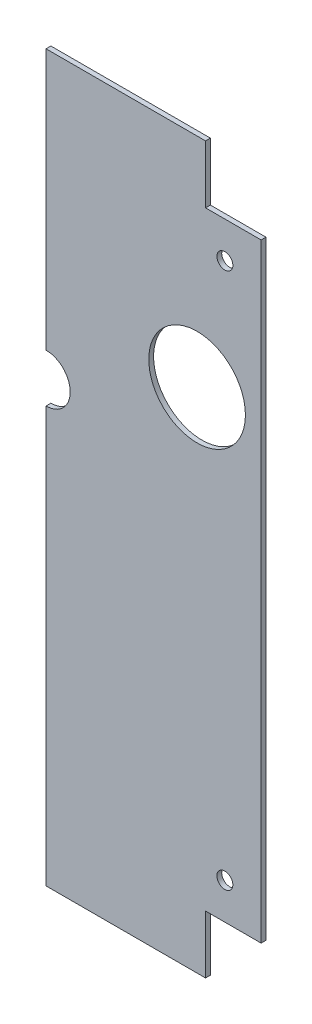
ISO-10303-21;
HEADER;
FILE_DESCRIPTION(('STEP AP214'),'2;1');
FILE_NAME('part.step','',(''),(''),'','','');
FILE_SCHEMA(('AUTOMOTIVE_DESIGN { 1 0 10303 214 1 1 1 1 }'));
ENDSEC;
DATA;
#1=APPLICATION_CONTEXT('core data for automotive mechanical design processes');
#2=APPLICATION_PROTOCOL_DEFINITION('international standard','automotive_design',2000,#1);
#3=PRODUCT_CONTEXT('',#1,'mechanical');
#4=PRODUCT('Part','Part','',(#3));
#5=PRODUCT_RELATED_PRODUCT_CATEGORY('part','',(#4));
#6=PRODUCT_DEFINITION_FORMATION('','',#4);
#7=PRODUCT_DEFINITION_CONTEXT('part definition',#1,'design');
#8=PRODUCT_DEFINITION('design','',#6,#7);
#9=PRODUCT_DEFINITION_SHAPE('','',#8);
#10=(LENGTH_UNIT() NAMED_UNIT(*) SI_UNIT(.MILLI.,.METRE.));
#11=(NAMED_UNIT(*) PLANE_ANGLE_UNIT() SI_UNIT($,.RADIAN.));
#12=(NAMED_UNIT(*) SI_UNIT($,.STERADIAN.) SOLID_ANGLE_UNIT());
#13=UNCERTAINTY_MEASURE_WITH_UNIT(LENGTH_MEASURE(1.E-05),#10,'distance_accuracy_value','');
#14=(GEOMETRIC_REPRESENTATION_CONTEXT(3) GLOBAL_UNCERTAINTY_ASSIGNED_CONTEXT((#13)) GLOBAL_UNIT_ASSIGNED_CONTEXT((#10,
#11,#12)) REPRESENTATION_CONTEXT('',''));
#15=CARTESIAN_POINT('',(0.,0.,0.));
#16=DIRECTION('',(0.,0.,1.));
#17=DIRECTION('',(1.,0.,0.));
#18=AXIS2_PLACEMENT_3D('',#15,#16,#17);
#19=CARTESIAN_POINT('',(-93.0014999999948,-0.0098386930458827,2.));
#20=DIRECTION('',(1.,0.,0.));
#21=DIRECTION('',(0.,1.,0.));
#22=AXIS2_PLACEMENT_3D('',#19,#20,#21);
#23=PLANE('',#22);
#24=DIRECTION('',(0.,-1.,0.));
#25=VECTOR('',#24,1.);
#26=CARTESIAN_POINT('',(-93.0014999999948,-0.0098386930458827,0.));
#27=LINE('',#26,#25);
#28=CARTESIAN_POINT('',(-93.0014999999948,-0.0098386930458827,0.));
#29=VERTEX_POINT('',#28);
#30=CARTESIAN_POINT('',(-93.0014999999948,-108.009838693046,0.));
#31=VERTEX_POINT('',#30);
#32=EDGE_CURVE('E147',#29,#31,#27,.T.);
#33=ORIENTED_EDGE('',*,*,#32,.T.);
#34=DIRECTION('',(0.,0.,1.));
#35=VECTOR('',#34,1.);
#36=CARTESIAN_POINT('',(-93.0014999999948,-108.009838693046,-8.));
#37=LINE('',#36,#35);
#38=CARTESIAN_POINT('',(-93.0014999999948,-108.009838693046,2.));
#39=VERTEX_POINT('',#38);
#40=EDGE_CURVE('E54',#31,#39,#37,.T.);
#41=ORIENTED_EDGE('',*,*,#40,.T.);
#42=DIRECTION('',(0.,-1.,0.));
#43=VECTOR('',#42,1.);
#44=CARTESIAN_POINT('',(-93.0014999999948,-0.0098386930458827,2.));
#45=LINE('',#44,#43);
#46=CARTESIAN_POINT('',(-93.0014999999948,-0.0098386930458827,2.));
#47=VERTEX_POINT('',#46);
#48=EDGE_CURVE('E196',#47,#39,#45,.T.);
#49=ORIENTED_EDGE('',*,*,#48,.F.);
#50=DIRECTION('',(0.,0.,-1.));
#51=VECTOR('',#50,1.);
#52=CARTESIAN_POINT('',(-93.0014999999948,-0.0098386930458827,2.));
#53=LINE('',#52,#51);
#54=EDGE_CURVE('E143',#47,#29,#53,.T.);
#55=ORIENTED_EDGE('',*,*,#54,.T.);
#56=EDGE_LOOP('',(#33,#41,#49,#55));
#57=FACE_BOUND('',#56,.T.);
#58=ADVANCED_FACE('F39',(#57),#23,.F.);
#59=CARTESIAN_POINT('',(-93.0014999999948,-128.009838693046,2.));
#60=VERTEX_POINT('',#59);
#61=CARTESIAN_POINT('',(-93.0014999999947,-300.009838693046,2.));
#62=VERTEX_POINT('',#61);
#63=EDGE_CURVE('E103',#60,#62,#45,.T.);
#64=ORIENTED_EDGE('',*,*,#63,.F.);
#65=DIRECTION('',(0.,0.,1.));
#66=VECTOR('',#65,1.);
#67=CARTESIAN_POINT('',(-93.0014999999948,-128.009838693046,-8.));
#68=LINE('',#67,#66);
#69=CARTESIAN_POINT('',(-93.0014999999948,-128.009838693046,0.));
#70=VERTEX_POINT('',#69);
#71=EDGE_CURVE('E179',#60,#70,#68,.F.);
#72=ORIENTED_EDGE('',*,*,#71,.T.);
#73=CARTESIAN_POINT('',(-93.0014999999947,-300.009838693046,0.));
#74=VERTEX_POINT('',#73);
#75=EDGE_CURVE('E151',#70,#74,#27,.T.);
#76=ORIENTED_EDGE('',*,*,#75,.T.);
#77=DIRECTION('',(0.,0.,-1.));
#78=VECTOR('',#77,1.);
#79=CARTESIAN_POINT('',(-93.0014999999947,-300.009838693046,2.));
#80=LINE('',#79,#78);
#81=EDGE_CURVE('E47',#62,#74,#80,.T.);
#82=ORIENTED_EDGE('',*,*,#81,.F.);
#83=EDGE_LOOP('',(#64,#72,#76,#82));
#84=FACE_BOUND('',#83,.T.);
#85=ADVANCED_FACE('F41',(#84),#23,.F.);
#86=CARTESIAN_POINT('',(-93.0014999999947,-300.009838693046,2.));
#87=DIRECTION('',(0.,1.,0.));
#88=DIRECTION('',(0.,0.,1.));
#89=AXIS2_PLACEMENT_3D('',#86,#87,#88);
#90=PLANE('',#89);
#91=DIRECTION('',(1.,0.,0.));
#92=VECTOR('',#91,1.);
#93=CARTESIAN_POINT('',(-93.0014999999947,-300.009838693046,0.));
#94=LINE('',#93,#92);
#95=CARTESIAN_POINT('',(-27.0014999999947,-300.009838693046,0.));
#96=VERTEX_POINT('',#95);
#97=EDGE_CURVE('E150',#74,#96,#94,.T.);
#98=ORIENTED_EDGE('',*,*,#97,.T.);
#99=DIRECTION('',(0.,0.,-1.));
#100=VECTOR('',#99,1.);
#101=CARTESIAN_POINT('',(-27.0014999999947,-300.009838693046,2.));
#102=LINE('',#101,#100);
#103=CARTESIAN_POINT('',(-27.0014999999947,-300.009838693046,2.));
#104=VERTEX_POINT('',#103);
#105=EDGE_CURVE('E173',#104,#96,#102,.T.);
#106=ORIENTED_EDGE('',*,*,#105,.F.);
#107=DIRECTION('',(1.,0.,0.));
#108=VECTOR('',#107,1.);
#109=CARTESIAN_POINT('',(-93.0014999999947,-300.009838693046,2.));
#110=LINE('',#109,#108);
#111=EDGE_CURVE('E198',#62,#104,#110,.T.);
#112=ORIENTED_EDGE('',*,*,#111,.F.);
#113=ORIENTED_EDGE('',*,*,#81,.T.);
#114=EDGE_LOOP('',(#98,#106,#112,#113));
#115=FACE_BOUND('',#114,.T.);
#116=ADVANCED_FACE('F224',(#115),#90,.F.);
#117=CARTESIAN_POINT('',(-27.0014999999947,-300.009838693046,2.));
#118=DIRECTION('',(-1.,0.,0.));
#119=DIRECTION('',(0.,-1.,0.));
#120=AXIS2_PLACEMENT_3D('',#117,#118,#119);
#121=PLANE('',#120);
#122=DIRECTION('',(0.,1.,0.));
#123=VECTOR('',#122,1.);
#124=CARTESIAN_POINT('',(-27.0014999999947,-300.009838693046,0.));
#125=LINE('',#124,#123);
#126=CARTESIAN_POINT('',(-27.0014999999947,-276.009838693046,0.));
#127=VERTEX_POINT('',#126);
#128=EDGE_CURVE('E153',#96,#127,#125,.T.);
#129=ORIENTED_EDGE('',*,*,#128,.T.);
#130=DIRECTION('',(0.,0.,-1.));
#131=VECTOR('',#130,1.);
#132=CARTESIAN_POINT('',(-27.0014999999947,-276.009838693046,2.));
#133=LINE('',#132,#131);
#134=CARTESIAN_POINT('',(-27.0014999999947,-276.009838693046,2.));
#135=VERTEX_POINT('',#134);
#136=EDGE_CURVE('E170',#135,#127,#133,.T.);
#137=ORIENTED_EDGE('',*,*,#136,.F.);
#138=DIRECTION('',(0.,1.,0.));
#139=VECTOR('',#138,1.);
#140=CARTESIAN_POINT('',(-27.0014999999947,-300.009838693046,2.));
#141=LINE('',#140,#139);
#142=EDGE_CURVE('E200',#104,#135,#141,.T.);
#143=ORIENTED_EDGE('',*,*,#142,.F.);
#144=ORIENTED_EDGE('',*,*,#105,.T.);
#145=EDGE_LOOP('',(#129,#137,#143,#144));
#146=FACE_BOUND('',#145,.T.);
#147=ADVANCED_FACE('F229',(#146),#121,.F.);
#148=CARTESIAN_POINT('',(-27.0014999999947,-276.009838693046,2.));
#149=DIRECTION('',(0.,1.,0.));
#150=DIRECTION('',(0.,0.,1.));
#151=AXIS2_PLACEMENT_3D('',#148,#149,#150);
#152=PLANE('',#151);
#153=DIRECTION('',(1.,0.,0.));
#154=VECTOR('',#153,1.);
#155=CARTESIAN_POINT('',(-27.0014999999947,-276.009838693046,0.));
#156=LINE('',#155,#154);
#157=CARTESIAN_POINT('',(-4.00149999999474,-276.009838693046,0.));
#158=VERTEX_POINT('',#157);
#159=EDGE_CURVE('E155',#127,#158,#156,.T.);
#160=ORIENTED_EDGE('',*,*,#159,.T.);
#161=DIRECTION('',(0.,0.,-1.));
#162=VECTOR('',#161,1.);
#163=CARTESIAN_POINT('',(-4.00149999999474,-276.009838693046,2.));
#164=LINE('',#163,#162);
#165=CARTESIAN_POINT('',(-4.00149999999474,-276.009838693046,2.));
#166=VERTEX_POINT('',#165);
#167=EDGE_CURVE('E168',#166,#158,#164,.T.);
#168=ORIENTED_EDGE('',*,*,#167,.F.);
#169=DIRECTION('',(1.,0.,0.));
#170=VECTOR('',#169,1.);
#171=CARTESIAN_POINT('',(-27.0014999999947,-276.009838693046,2.));
#172=LINE('',#171,#170);
#173=EDGE_CURVE('E202',#135,#166,#172,.T.);
#174=ORIENTED_EDGE('',*,*,#173,.F.);
#175=ORIENTED_EDGE('',*,*,#136,.T.);
#176=EDGE_LOOP('',(#160,#168,#174,#175));
#177=FACE_BOUND('',#176,.T.);
#178=ADVANCED_FACE('F231',(#177),#152,.F.);
#179=CARTESIAN_POINT('',(-4.00149999999482,-24.0098386930459,2.));
#180=DIRECTION('',(1.,0.,0.));
#181=DIRECTION('',(0.,1.,0.));
#182=AXIS2_PLACEMENT_3D('',#179,#180,#181);
#183=PLANE('',#182);
#184=DIRECTION('',(0.,-1.,0.));
#185=VECTOR('',#184,1.);
#186=CARTESIAN_POINT('',(-4.00149999999482,-24.0098386930459,0.));
#187=LINE('',#186,#185);
#188=CARTESIAN_POINT('',(-4.00149999999482,-24.0098386930459,0.));
#189=VERTEX_POINT('',#188);
#190=EDGE_CURVE('E158',#189,#158,#187,.T.);
#191=ORIENTED_EDGE('',*,*,#190,.F.);
#192=DIRECTION('',(0.,0.,-1.));
#193=VECTOR('',#192,1.);
#194=CARTESIAN_POINT('',(-4.00149999999482,-24.0098386930459,2.));
#195=LINE('',#194,#193);
#196=CARTESIAN_POINT('',(-4.00149999999482,-24.0098386930459,2.));
#197=VERTEX_POINT('',#196);
#198=EDGE_CURVE('E138',#197,#189,#195,.T.);
#199=ORIENTED_EDGE('',*,*,#198,.F.);
#200=DIRECTION('',(0.,-1.,0.));
#201=VECTOR('',#200,1.);
#202=CARTESIAN_POINT('',(-4.00149999999482,-24.0098386930459,2.));
#203=LINE('',#202,#201);
#204=EDGE_CURVE('E128',#197,#166,#203,.T.);
#205=ORIENTED_EDGE('',*,*,#204,.T.);
#206=ORIENTED_EDGE('',*,*,#167,.T.);
#207=EDGE_LOOP('',(#191,#199,#205,#206));
#208=FACE_BOUND('',#207,.T.);
#209=ADVANCED_FACE('F205',(#208),#183,.T.);
#210=CARTESIAN_POINT('',(-4.00149999999482,-24.0098386930459,2.));
#211=DIRECTION('',(0.,-1.,0.));
#212=DIRECTION('',(1.,0.,0.));
#213=AXIS2_PLACEMENT_3D('',#210,#211,#212);
#214=PLANE('',#213);
#215=DIRECTION('',(-1.,0.,0.));
#216=VECTOR('',#215,1.);
#217=CARTESIAN_POINT('',(-4.00149999999482,-24.0098386930459,0.));
#218=LINE('',#217,#216);
#219=CARTESIAN_POINT('',(-27.0014999999948,-24.0098386930459,0.));
#220=VERTEX_POINT('',#219);
#221=EDGE_CURVE('E135',#189,#220,#218,.T.);
#222=ORIENTED_EDGE('',*,*,#221,.T.);
#223=DIRECTION('',(0.,0.,-1.));
#224=VECTOR('',#223,1.);
#225=CARTESIAN_POINT('',(-27.0014999999948,-24.0098386930459,2.));
#226=LINE('',#225,#224);
#227=CARTESIAN_POINT('',(-27.0014999999948,-24.0098386930459,2.));
#228=VERTEX_POINT('',#227);
#229=EDGE_CURVE('E132',#228,#220,#226,.T.);
#230=ORIENTED_EDGE('',*,*,#229,.F.);
#231=DIRECTION('',(-1.,0.,0.));
#232=VECTOR('',#231,1.);
#233=CARTESIAN_POINT('',(-4.00149999999482,-24.0098386930459,2.));
#234=LINE('',#233,#232);
#235=EDGE_CURVE('E120',#197,#228,#234,.T.);
#236=ORIENTED_EDGE('',*,*,#235,.F.);
#237=ORIENTED_EDGE('',*,*,#198,.T.);
#238=EDGE_LOOP('',(#222,#230,#236,#237));
#239=FACE_BOUND('',#238,.T.);
#240=ADVANCED_FACE('F133',(#239),#214,.F.);
#241=CARTESIAN_POINT('',(-27.0014999999948,-24.0098386930459,2.));
#242=DIRECTION('',(-1.,0.,0.));
#243=DIRECTION('',(0.,0.,1.));
#244=AXIS2_PLACEMENT_3D('',#241,#242,#243);
#245=PLANE('',#244);
#246=DIRECTION('',(0.,1.,0.));
#247=VECTOR('',#246,1.);
#248=CARTESIAN_POINT('',(-27.0014999999948,-24.0098386930459,0.));
#249=LINE('',#248,#247);
#250=CARTESIAN_POINT('',(-27.0014999999948,-0.00983869304587489,0.));
#251=VERTEX_POINT('',#250);
#252=EDGE_CURVE('E162',#220,#251,#249,.T.);
#253=ORIENTED_EDGE('',*,*,#252,.T.);
#254=DIRECTION('',(0.,0.,-1.));
#255=VECTOR('',#254,1.);
#256=CARTESIAN_POINT('',(-27.0014999999948,-0.00983869304587489,2.));
#257=LINE('',#256,#255);
#258=CARTESIAN_POINT('',(-27.0014999999948,-0.00983869304587489,2.));
#259=VERTEX_POINT('',#258);
#260=EDGE_CURVE('E139',#259,#251,#257,.T.);
#261=ORIENTED_EDGE('',*,*,#260,.F.);
#262=DIRECTION('',(0.,1.,0.));
#263=VECTOR('',#262,1.);
#264=CARTESIAN_POINT('',(-27.0014999999948,-24.0098386930459,2.));
#265=LINE('',#264,#263);
#266=EDGE_CURVE('E125',#228,#259,#265,.T.);
#267=ORIENTED_EDGE('',*,*,#266,.F.);
#268=ORIENTED_EDGE('',*,*,#229,.T.);
#269=EDGE_LOOP('',(#253,#261,#267,#268));
#270=FACE_BOUND('',#269,.T.);
#271=ADVANCED_FACE('F141',(#270),#245,.F.);
#272=CARTESIAN_POINT('',(-27.0014999999948,-0.00983869304587489,2.));
#273=DIRECTION('',(0.,-1.,0.));
#274=DIRECTION('',(1.,0.,0.));
#275=AXIS2_PLACEMENT_3D('',#272,#273,#274);
#276=PLANE('',#275);
#277=DIRECTION('',(-1.,0.,0.));
#278=VECTOR('',#277,1.);
#279=CARTESIAN_POINT('',(-27.0014999999948,-0.00983869304587489,0.));
#280=LINE('',#279,#278);
#281=EDGE_CURVE('E95',#251,#29,#280,.T.);
#282=ORIENTED_EDGE('',*,*,#281,.T.);
#283=ORIENTED_EDGE('',*,*,#54,.F.);
#284=DIRECTION('',(-1.,0.,0.));
#285=VECTOR('',#284,1.);
#286=CARTESIAN_POINT('',(-27.0014999999948,-0.00983869304587489,2.));
#287=LINE('',#286,#285);
#288=EDGE_CURVE('E62',#259,#47,#287,.T.);
#289=ORIENTED_EDGE('',*,*,#288,.F.);
#290=ORIENTED_EDGE('',*,*,#260,.T.);
#291=EDGE_LOOP('',(#282,#283,#289,#290));
#292=FACE_BOUND('',#291,.T.);
#293=ADVANCED_FACE('F212',(#292),#276,.F.);
#294=CARTESIAN_POINT('',(0.,0.,2.));
#295=DIRECTION('',(0.,0.,1.));
#296=DIRECTION('',(1.,0.,0.));
#297=AXIS2_PLACEMENT_3D('',#294,#295,#296);
#298=PLANE('',#297);
#299=CARTESIAN_POINT('',(-19.0014999999948,-39.0098386930459,2.));
#300=DIRECTION('',(0.,0.,1.));
#301=DIRECTION('',(1.,0.,0.));
#302=AXIS2_PLACEMENT_3D('',#299,#300,#301);
#303=CIRCLE('',#302,3.3);
#304=CARTESIAN_POINT('',(-15.7014999999948,-39.0098386930459,2.));
#305=VERTEX_POINT('',#304);
#306=EDGE_CURVE('E378',#305,#305,#303,.T.);
#307=ORIENTED_EDGE('',*,*,#306,.F.);
#308=EDGE_LOOP('',(#307));
#309=FACE_BOUND('',#308,.T.);
#310=CARTESIAN_POINT('',(-19.0014999999948,-261.009838693046,2.));
#311=DIRECTION('',(0.,0.,1.));
#312=DIRECTION('',(1.,0.,0.));
#313=AXIS2_PLACEMENT_3D('',#310,#311,#312);
#314=CIRCLE('',#313,3.3);
#315=CARTESIAN_POINT('',(-15.7014999999948,-261.009838693046,2.));
#316=VERTEX_POINT('',#315);
#317=EDGE_CURVE('E380',#316,#316,#314,.T.);
#318=ORIENTED_EDGE('',*,*,#317,.F.);
#319=EDGE_LOOP('',(#318));
#320=FACE_BOUND('',#319,.T.);
#321=CARTESIAN_POINT('',(-93.0014999999948,-118.009838693046,2.));
#322=DIRECTION('',(0.,0.,1.));
#323=DIRECTION('',(1.,0.,0.));
#324=AXIS2_PLACEMENT_3D('',#321,#322,#323);
#325=CIRCLE('',#324,9.99999999999999);
#326=EDGE_CURVE('E180',#60,#39,#325,.T.);
#327=ORIENTED_EDGE('',*,*,#326,.F.);
#328=ORIENTED_EDGE('',*,*,#63,.T.);
#329=ORIENTED_EDGE('',*,*,#111,.T.);
#330=ORIENTED_EDGE('',*,*,#142,.T.);
#331=ORIENTED_EDGE('',*,*,#173,.T.);
#332=ORIENTED_EDGE('',*,*,#204,.F.);
#333=ORIENTED_EDGE('',*,*,#235,.T.);
#334=ORIENTED_EDGE('',*,*,#266,.T.);
#335=ORIENTED_EDGE('',*,*,#288,.T.);
#336=ORIENTED_EDGE('',*,*,#48,.T.);
#337=EDGE_LOOP('',(#327,#328,#329,#330,#331,#332,#333,#334,#335,#336));
#338=FACE_BOUND('',#337,.T.);
#339=CARTESIAN_POINT('',(-30.4999999999954,-90.0098386930459,2.));
#340=DIRECTION('',(0.,0.,1.));
#341=DIRECTION('',(1.,0.,0.));
#342=AXIS2_PLACEMENT_3D('',#339,#340,#341);
#343=CIRCLE('',#342,20.);
#344=CARTESIAN_POINT('',(-10.4999999999954,-90.0098386930459,2.));
#345=VERTEX_POINT('',#344);
#346=EDGE_CURVE('E185',#345,#345,#343,.T.);
#347=ORIENTED_EDGE('',*,*,#346,.F.);
#348=EDGE_LOOP('',(#347));
#349=FACE_BOUND('',#348,.T.);
#350=ADVANCED_FACE('F122',(#309,#320,#338,#349),#298,.T.);
#351=CARTESIAN_POINT('',(0.,0.,0.));
#352=DIRECTION('',(0.,0.,1.));
#353=DIRECTION('',(1.,0.,0.));
#354=AXIS2_PLACEMENT_3D('',#351,#352,#353);
#355=PLANE('',#354);
#356=CARTESIAN_POINT('',(-19.0014999999948,-39.0098386930459,0.));
#357=DIRECTION('',(0.,0.,1.));
#358=DIRECTION('',(1.,0.,0.));
#359=AXIS2_PLACEMENT_3D('',#356,#357,#358);
#360=CIRCLE('',#359,3.3);
#361=CARTESIAN_POINT('',(-15.7014999999948,-39.0098386930459,0.));
#362=VERTEX_POINT('',#361);
#363=EDGE_CURVE('E375',#362,#362,#360,.T.);
#364=ORIENTED_EDGE('',*,*,#363,.T.);
#365=EDGE_LOOP('',(#364));
#366=FACE_BOUND('',#365,.T.);
#367=CARTESIAN_POINT('',(-19.0014999999948,-261.009838693046,0.));
#368=DIRECTION('',(0.,0.,1.));
#369=DIRECTION('',(1.,0.,0.));
#370=AXIS2_PLACEMENT_3D('',#367,#368,#369);
#371=CIRCLE('',#370,3.3);
#372=CARTESIAN_POINT('',(-15.7014999999948,-261.009838693046,0.));
#373=VERTEX_POINT('',#372);
#374=EDGE_CURVE('E190',#373,#373,#371,.T.);
#375=ORIENTED_EDGE('',*,*,#374,.T.);
#376=EDGE_LOOP('',(#375));
#377=FACE_BOUND('',#376,.T.);
#378=CARTESIAN_POINT('',(-30.4999999999954,-90.0098386930459,0.));
#379=DIRECTION('',(0.,0.,1.));
#380=DIRECTION('',(1.,0.,0.));
#381=AXIS2_PLACEMENT_3D('',#378,#379,#380);
#382=CIRCLE('',#381,20.);
#383=CARTESIAN_POINT('',(-10.4999999999954,-90.0098386930459,0.));
#384=VERTEX_POINT('',#383);
#385=EDGE_CURVE('E177',#384,#384,#382,.T.);
#386=ORIENTED_EDGE('',*,*,#385,.T.);
#387=EDGE_LOOP('',(#386));
#388=FACE_BOUND('',#387,.T.);
#389=ORIENTED_EDGE('',*,*,#75,.F.);
#390=CARTESIAN_POINT('',(-93.0014999999948,-118.009838693046,0.));
#391=DIRECTION('',(0.,0.,1.));
#392=DIRECTION('',(1.,0.,0.));
#393=AXIS2_PLACEMENT_3D('',#390,#391,#392);
#394=CIRCLE('',#393,9.99999999999999);
#395=EDGE_CURVE('E11',#70,#31,#394,.T.);
#396=ORIENTED_EDGE('',*,*,#395,.T.);
#397=ORIENTED_EDGE('',*,*,#32,.F.);
#398=ORIENTED_EDGE('',*,*,#281,.F.);
#399=ORIENTED_EDGE('',*,*,#252,.F.);
#400=ORIENTED_EDGE('',*,*,#221,.F.);
#401=ORIENTED_EDGE('',*,*,#190,.T.);
#402=ORIENTED_EDGE('',*,*,#159,.F.);
#403=ORIENTED_EDGE('',*,*,#128,.F.);
#404=ORIENTED_EDGE('',*,*,#97,.F.);
#405=EDGE_LOOP('',(#389,#396,#397,#398,#399,#400,#401,#402,#403,#404));
#406=FACE_BOUND('',#405,.T.);
#407=ADVANCED_FACE('F209',(#366,#377,#388,#406),#355,.F.);
#408=CARTESIAN_POINT('',(-30.4999999999954,-90.0098386930459,-8.));
#409=DIRECTION('',(0.,0.,1.));
#410=DIRECTION('',(1.,0.,0.));
#411=AXIS2_PLACEMENT_3D('',#408,#409,#410);
#412=CYLINDRICAL_SURFACE('',#411,20.);
#413=ORIENTED_EDGE('',*,*,#346,.T.);
#414=EDGE_LOOP('',(#413));
#415=FACE_BOUND('',#414,.T.);
#416=ORIENTED_EDGE('',*,*,#385,.F.);
#417=EDGE_LOOP('',(#416));
#418=FACE_BOUND('',#417,.T.);
#419=ADVANCED_FACE('F311',(#415,#418),#412,.F.);
#420=CARTESIAN_POINT('',(-93.0014999999948,-118.009838693046,-8.));
#421=DIRECTION('',(0.,0.,1.));
#422=DIRECTION('',(1.,0.,0.));
#423=AXIS2_PLACEMENT_3D('',#420,#421,#422);
#424=CYLINDRICAL_SURFACE('',#423,9.99999999999999);
#425=ORIENTED_EDGE('',*,*,#395,.F.);
#426=ORIENTED_EDGE('',*,*,#71,.F.);
#427=ORIENTED_EDGE('',*,*,#326,.T.);
#428=ORIENTED_EDGE('',*,*,#40,.F.);
#429=EDGE_LOOP('',(#425,#426,#427,#428));
#430=FACE_BOUND('',#429,.T.);
#431=ADVANCED_FACE('F217',(#430),#424,.F.);
#432=CARTESIAN_POINT('',(-19.0014999999948,-261.009838693046,2.));
#433=DIRECTION('',(0.,0.,1.));
#434=DIRECTION('',(1.,0.,0.));
#435=AXIS2_PLACEMENT_3D('',#432,#433,#434);
#436=CYLINDRICAL_SURFACE('',#435,3.3);
#437=ORIENTED_EDGE('',*,*,#374,.F.);
#438=EDGE_LOOP('',(#437));
#439=FACE_BOUND('',#438,.T.);
#440=ORIENTED_EDGE('',*,*,#317,.T.);
#441=EDGE_LOOP('',(#440));
#442=FACE_BOUND('',#441,.T.);
#443=ADVANCED_FACE('F326',(#439,#442),#436,.F.);
#444=CARTESIAN_POINT('',(-19.0014999999948,-39.0098386930459,2.));
#445=DIRECTION('',(0.,0.,1.));
#446=DIRECTION('',(1.,0.,0.));
#447=AXIS2_PLACEMENT_3D('',#444,#445,#446);
#448=CYLINDRICAL_SURFACE('',#447,3.3);
#449=ORIENTED_EDGE('',*,*,#363,.F.);
#450=EDGE_LOOP('',(#449));
#451=FACE_BOUND('',#450,.T.);
#452=ORIENTED_EDGE('',*,*,#306,.T.);
#453=EDGE_LOOP('',(#452));
#454=FACE_BOUND('',#453,.T.);
#455=ADVANCED_FACE('F352',(#451,#454),#448,.F.);
#456=CLOSED_SHELL('',(#58,#85,#116,#147,#178,#209,#240,#271,#293,#350,#407,#419,#431,#443,#455));
#457=MANIFOLD_SOLID_BREP('B2',#456);
#458=ADVANCED_BREP_SHAPE_REPRESENTATION('',(#18,#457),#14);
#459=SHAPE_DEFINITION_REPRESENTATION(#9,#458);
ENDSEC;
END-ISO-10303-21;
